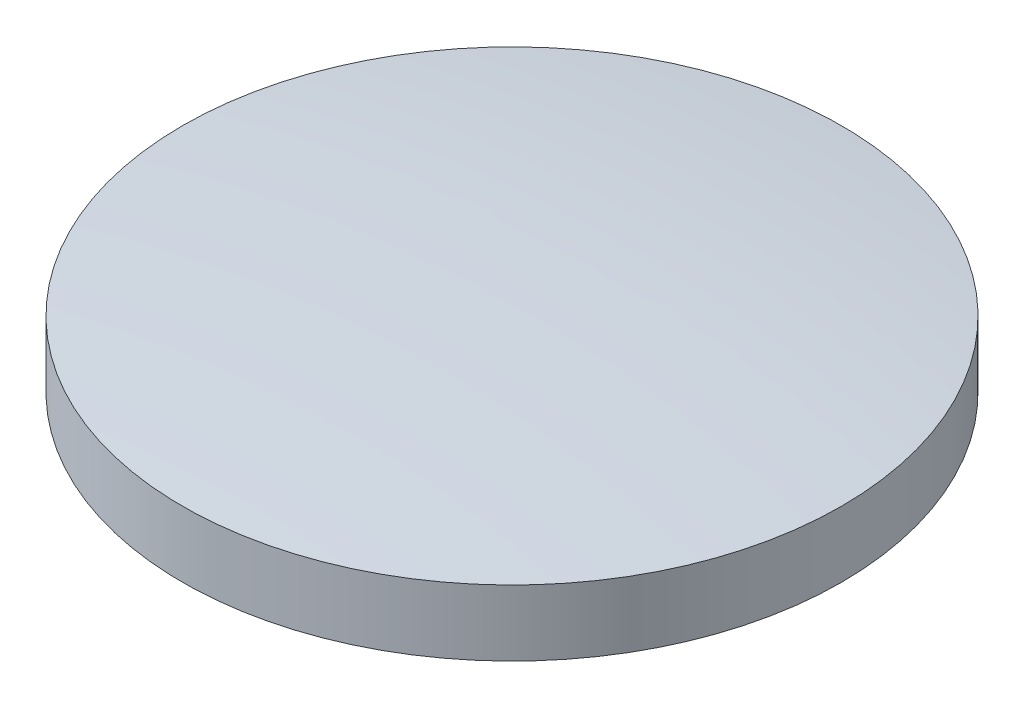
ISO-10303-21;
HEADER;
FILE_DESCRIPTION(('STEP AP214'),'2;1');
FILE_NAME('part.step','',(''),(''),'','','');
FILE_SCHEMA(('AUTOMOTIVE_DESIGN { 1 0 10303 214 1 1 1 1 }'));
ENDSEC;
DATA;
#1=APPLICATION_CONTEXT('core data for automotive mechanical design processes');
#2=APPLICATION_PROTOCOL_DEFINITION('international standard','automotive_design',2000,#1);
#3=PRODUCT_CONTEXT('',#1,'mechanical');
#4=PRODUCT('Part','Part','',(#3));
#5=PRODUCT_RELATED_PRODUCT_CATEGORY('part','',(#4));
#6=PRODUCT_DEFINITION_FORMATION('','',#4);
#7=PRODUCT_DEFINITION_CONTEXT('part definition',#1,'design');
#8=PRODUCT_DEFINITION('design','',#6,#7);
#9=PRODUCT_DEFINITION_SHAPE('','',#8);
#10=(LENGTH_UNIT() NAMED_UNIT(*) SI_UNIT(.MILLI.,.METRE.));
#11=(NAMED_UNIT(*) PLANE_ANGLE_UNIT() SI_UNIT($,.RADIAN.));
#12=(NAMED_UNIT(*) SI_UNIT($,.STERADIAN.) SOLID_ANGLE_UNIT());
#13=UNCERTAINTY_MEASURE_WITH_UNIT(LENGTH_MEASURE(1.E-05),#10,'distance_accuracy_value','');
#14=(GEOMETRIC_REPRESENTATION_CONTEXT(3) GLOBAL_UNCERTAINTY_ASSIGNED_CONTEXT((#13)) GLOBAL_UNIT_ASSIGNED_CONTEXT((#10,
#11,#12)) REPRESENTATION_CONTEXT('',''));
#15=CARTESIAN_POINT('',(0.,0.,0.));
#16=DIRECTION('',(0.,0.,1.));
#17=DIRECTION('',(1.,0.,0.));
#18=AXIS2_PLACEMENT_3D('',#15,#16,#17);
#19=CARTESIAN_POINT('',(0.,-82.0333333333335,0.));
#20=DIRECTION('',(0.,1.,0.));
#21=DIRECTION('',(-1.,0.,0.));
#22=AXIS2_PLACEMENT_3D('',#19,#20,#21);
#23=SPHERICAL_SURFACE('',#22,83.6333333333335);
#24=CARTESIAN_POINT('',(0.,0.999999999999948,0.));
#25=DIRECTION('',(0.,1.,0.));
#26=DIRECTION('',(-1.,0.,0.));
#27=AXIS2_PLACEMENT_3D('',#24,#25,#26);
#28=CIRCLE('',#27,10.);
#29=CARTESIAN_POINT('',(-10.,0.999999999999998,0.));
#30=VERTEX_POINT('',#29);
#31=EDGE_CURVE('E40',#30,#30,#28,.T.);
#32=ORIENTED_EDGE('',*,*,#31,.T.);
#33=EDGE_LOOP('',(#32));
#34=FACE_BOUND('',#33,.T.);
#35=ADVANCED_FACE('F34',(#34),#23,.T.);
#36=CARTESIAN_POINT('',(-0.0778623573003591,-84.0426735422446,0.));
#37=DIRECTION('',(0.,0.,-1.));
#38=DIRECTION('',(-1.,0.,0.));
#39=AXIS2_PLACEMENT_3D('',#36,#37,#38);
#40=CIRCLE('',#39,83.6333333333335);
#41=TRIMMED_CURVE('',#40,(PARAMETER_VALUE(-1.57172732362887)),
(PARAMETER_VALUE(1.57172732362887)),.T.,.PARAMETER.);
#42=CARTESIAN_POINT('',(-4.13704443966156E-13,-84.0426735422446,0.));
#43=DIRECTION('',(0.,1.,0.));
#44=AXIS1_PLACEMENT('',#42,#43);
#45=SURFACE_OF_REVOLUTION('',#41,#44);
#46=CARTESIAN_POINT('',(0.,-0.409376453717705,0.));
#47=VERTEX_POINT('',#46);
#48=VERTEX_LOOP('',#47);
#49=FACE_BOUND('',#48,.T.);
#50=CARTESIAN_POINT('',(0.,-1.00000000000005,0.));
#51=DIRECTION('',(0.,1.,0.));
#52=DIRECTION('',(-1.,0.,0.));
#53=AXIS2_PLACEMENT_3D('',#50,#51,#52);
#54=CIRCLE('',#53,10.);
#55=CARTESIAN_POINT('',(-10.,-1.,0.));
#56=VERTEX_POINT('',#55);
#57=EDGE_CURVE('E11',#56,#56,#54,.T.);
#58=ORIENTED_EDGE('',*,*,#57,.F.);
#59=EDGE_LOOP('',(#58));
#60=FACE_BOUND('',#59,.T.);
#61=ADVANCED_FACE('F43',(#49,#60),#45,.F.);
#62=CARTESIAN_POINT('',(0.,1.6,0.));
#63=DIRECTION('',(0.,1.,0.));
#64=DIRECTION('',(-1.,0.,0.));
#65=AXIS2_PLACEMENT_3D('',#62,#63,#64);
#66=CYLINDRICAL_SURFACE('',#65,10.);
#67=ORIENTED_EDGE('',*,*,#57,.T.);
#68=EDGE_LOOP('',(#67));
#69=FACE_BOUND('',#68,.T.);
#70=ORIENTED_EDGE('',*,*,#31,.F.);
#71=EDGE_LOOP('',(#70));
#72=FACE_BOUND('',#71,.T.);
#73=ADVANCED_FACE('F46',(#69,#72),#66,.T.);
#74=CLOSED_SHELL('',(#35,#61,#73));
#75=MANIFOLD_SOLID_BREP('B2',#74);
#76=ADVANCED_BREP_SHAPE_REPRESENTATION('',(#18,#75),#14);
#77=SHAPE_DEFINITION_REPRESENTATION(#9,#76);
ENDSEC;
END-ISO-10303-21;
